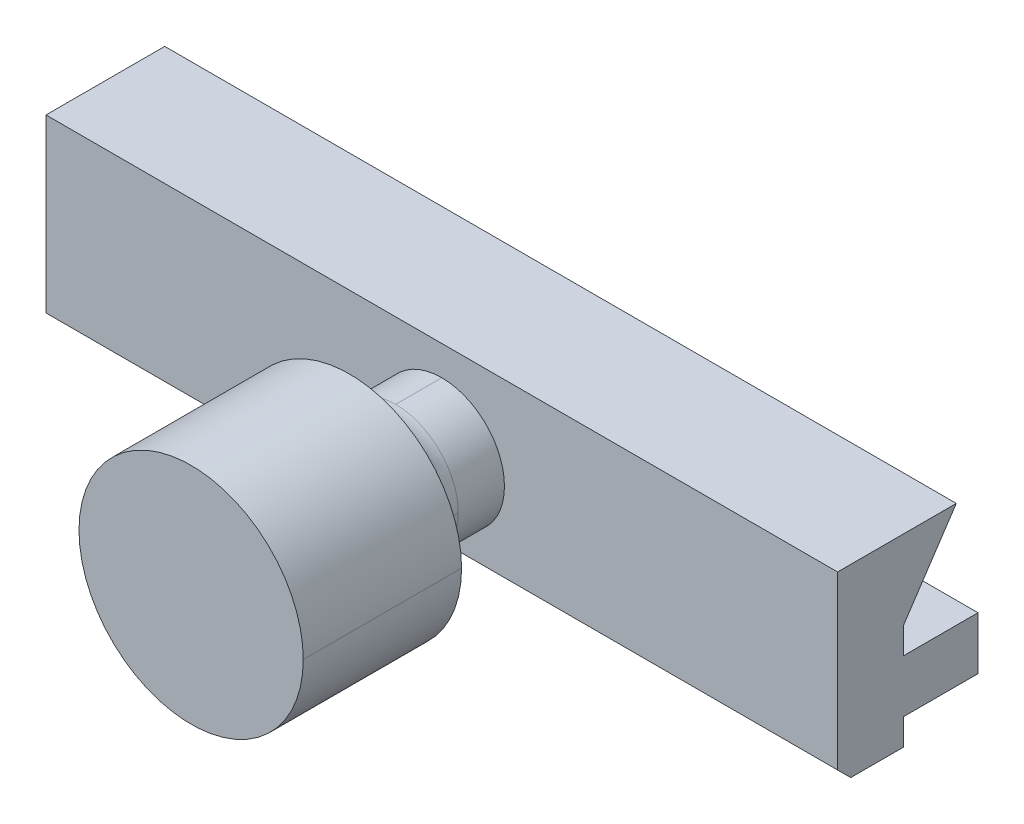
ISO-10303-21;
HEADER;
FILE_DESCRIPTION(('STEP AP214'),'2;1');
FILE_NAME('part.step','',(''),(''),'','','');
FILE_SCHEMA(('AUTOMOTIVE_DESIGN { 1 0 10303 214 1 1 1 1 }'));
ENDSEC;
DATA;
#1=APPLICATION_CONTEXT('core data for automotive mechanical design processes');
#2=APPLICATION_PROTOCOL_DEFINITION('international standard','automotive_design',2000,#1);
#3=PRODUCT_CONTEXT('',#1,'mechanical');
#4=PRODUCT('Part','Part','',(#3));
#5=PRODUCT_RELATED_PRODUCT_CATEGORY('part','',(#4));
#6=PRODUCT_DEFINITION_FORMATION('','',#4);
#7=PRODUCT_DEFINITION_CONTEXT('part definition',#1,'design');
#8=PRODUCT_DEFINITION('design','',#6,#7);
#9=PRODUCT_DEFINITION_SHAPE('','',#8);
#10=(LENGTH_UNIT() NAMED_UNIT(*) SI_UNIT(.MILLI.,.METRE.));
#11=(NAMED_UNIT(*) PLANE_ANGLE_UNIT() SI_UNIT($,.RADIAN.));
#12=(NAMED_UNIT(*) SI_UNIT($,.STERADIAN.) SOLID_ANGLE_UNIT());
#13=UNCERTAINTY_MEASURE_WITH_UNIT(LENGTH_MEASURE(1.E-05),#10,'distance_accuracy_value','');
#14=(GEOMETRIC_REPRESENTATION_CONTEXT(3) GLOBAL_UNCERTAINTY_ASSIGNED_CONTEXT((#13)) GLOBAL_UNIT_ASSIGNED_CONTEXT((#10,
#11,#12)) REPRESENTATION_CONTEXT('',''));
#15=CARTESIAN_POINT('',(0.,0.,0.));
#16=DIRECTION('',(0.,0.,1.));
#17=DIRECTION('',(1.,0.,0.));
#18=AXIS2_PLACEMENT_3D('',#15,#16,#17);
#19=CARTESIAN_POINT('',(-30.,-14.,-5.));
#20=DIRECTION('',(0.,1.,0.));
#21=DIRECTION('',(1.,0.,0.));
#22=AXIS2_PLACEMENT_3D('',#19,#20,#21);
#23=PLANE('',#22);
#24=DIRECTION('',(1.,0.,0.));
#25=VECTOR('',#24,1.);
#26=CARTESIAN_POINT('',(0.,-14.,-5.));
#27=LINE('',#26,#25);
#28=CARTESIAN_POINT('',(-30.,-14.,-5.00000000134114));
#29=VERTEX_POINT('',#28);
#30=CARTESIAN_POINT('',(30.,-14.,-5.00000000134114));
#31=VERTEX_POINT('',#30);
#32=EDGE_CURVE('E10',#29,#31,#27,.T.);
#33=ORIENTED_EDGE('',*,*,#32,.T.);
#34=DIRECTION('',(0.,0.,-1.));
#35=VECTOR('',#34,1.);
#36=CARTESIAN_POINT('',(30.,-14.,-5.3221343875));
#37=LINE('',#36,#35);
#38=CARTESIAN_POINT('',(30.,-14.,-1.00000000160088));
#39=VERTEX_POINT('',#38);
#40=EDGE_CURVE('E218',#39,#31,#37,.T.);
#41=ORIENTED_EDGE('',*,*,#40,.F.);
#42=DIRECTION('',(-1.,0.,0.));
#43=VECTOR('',#42,1.);
#44=CARTESIAN_POINT('',(0.,-14.,-1.));
#45=LINE('',#44,#43);
#46=CARTESIAN_POINT('',(-30.,-14.,-1.));
#47=VERTEX_POINT('',#46);
#48=EDGE_CURVE('E235',#39,#47,#45,.T.);
#49=ORIENTED_EDGE('',*,*,#48,.T.);
#50=DIRECTION('',(0.,0.,-1.));
#51=VECTOR('',#50,1.);
#52=CARTESIAN_POINT('',(-30.,-14.,-5.3221343875));
#53=LINE('',#52,#51);
#54=EDGE_CURVE('E248',#47,#29,#53,.T.);
#55=ORIENTED_EDGE('',*,*,#54,.T.);
#56=EDGE_LOOP('',(#33,#41,#49,#55));
#57=FACE_BOUND('',#56,.T.);
#58=ADVANCED_FACE('F15',(#57),#23,.F.);
#59=CARTESIAN_POINT('',(-30.,-14.,-5.));
#60=DIRECTION('',(0.,0.,1.));
#61=DIRECTION('',(1.,0.,0.));
#62=AXIS2_PLACEMENT_3D('',#59,#60,#61);
#63=PLANE('',#62);
#64=DIRECTION('',(1.,0.,0.));
#65=VECTOR('',#64,1.);
#66=CARTESIAN_POINT('',(0.,-12.,-5.));
#67=LINE('',#66,#65);
#68=CARTESIAN_POINT('',(-30.,-11.9999999995,-5.00000000134114));
#69=VERTEX_POINT('',#68);
#70=CARTESIAN_POINT('',(30.,-11.9999999995,-5.00000000134114));
#71=VERTEX_POINT('',#70);
#72=EDGE_CURVE('E26',#69,#71,#67,.T.);
#73=ORIENTED_EDGE('',*,*,#72,.T.);
#74=DIRECTION('',(0.,1.,0.));
#75=VECTOR('',#74,1.);
#76=CARTESIAN_POINT('',(30.,-7.,-5.00000000536455));
#77=LINE('',#76,#75);
#78=EDGE_CURVE('E222',#31,#71,#77,.T.);
#79=ORIENTED_EDGE('',*,*,#78,.F.);
#80=ORIENTED_EDGE('',*,*,#32,.F.);
#81=DIRECTION('',(0.,1.,0.));
#82=VECTOR('',#81,1.);
#83=CARTESIAN_POINT('',(-30.,-7.,-5.00000000536455));
#84=LINE('',#83,#82);
#85=EDGE_CURVE('E244',#29,#69,#84,.T.);
#86=ORIENTED_EDGE('',*,*,#85,.T.);
#87=EDGE_LOOP('',(#73,#79,#80,#86));
#88=FACE_BOUND('',#87,.T.);
#89=ADVANCED_FACE('F473',(#88),#63,.F.);
#90=CARTESIAN_POINT('',(-30.,-12.,-10.644268775));
#91=DIRECTION('',(0.,1.,0.));
#92=DIRECTION('',(1.,0.,0.));
#93=AXIS2_PLACEMENT_3D('',#90,#91,#92);
#94=PLANE('',#93);
#95=DIRECTION('',(1.,0.,0.));
#96=VECTOR('',#95,1.);
#97=CARTESIAN_POINT('',(0.,-12.,-10.644268775));
#98=LINE('',#97,#96);
#99=CARTESIAN_POINT('',(-30.,-11.9999999995,-10.644268775));
#100=VERTEX_POINT('',#99);
#101=CARTESIAN_POINT('',(30.,-11.9999999995,-10.644268775));
#102=VERTEX_POINT('',#101);
#103=EDGE_CURVE('E226',#100,#102,#98,.T.);
#104=ORIENTED_EDGE('',*,*,#103,.T.);
#105=DIRECTION('',(0.,0.,-1.));
#106=VECTOR('',#105,1.);
#107=CARTESIAN_POINT('',(30.,-11.999999998,-5.3221343875));
#108=LINE('',#107,#106);
#109=EDGE_CURVE('E293',#71,#102,#108,.T.);
#110=ORIENTED_EDGE('',*,*,#109,.F.);
#111=ORIENTED_EDGE('',*,*,#72,.F.);
#112=DIRECTION('',(0.,0.,-1.));
#113=VECTOR('',#112,1.);
#114=CARTESIAN_POINT('',(-30.,-11.999999998,-5.3221343875));
#115=LINE('',#114,#113);
#116=EDGE_CURVE('E249',#69,#100,#115,.T.);
#117=ORIENTED_EDGE('',*,*,#116,.T.);
#118=EDGE_LOOP('',(#104,#110,#111,#117));
#119=FACE_BOUND('',#118,.T.);
#120=ADVANCED_FACE('F355',(#119),#94,.F.);
#121=CARTESIAN_POINT('',(-30.,-12.,-10.644268775));
#122=DIRECTION('',(0.,0.,1.));
#123=DIRECTION('',(1.,0.,0.));
#124=AXIS2_PLACEMENT_3D('',#121,#122,#123);
#125=PLANE('',#124);
#126=DIRECTION('',(1.,0.,0.));
#127=VECTOR('',#126,1.);
#128=CARTESIAN_POINT('',(0.,-8.,-10.644268775));
#129=LINE('',#128,#127);
#130=CARTESIAN_POINT('',(-30.,-7.9999999985,-10.644268775));
#131=VERTEX_POINT('',#130);
#132=CARTESIAN_POINT('',(30.,-7.9999999985,-10.644268775));
#133=VERTEX_POINT('',#132);
#134=EDGE_CURVE('E41',#131,#133,#129,.T.);
#135=ORIENTED_EDGE('',*,*,#134,.T.);
#136=DIRECTION('',(0.,1.,0.));
#137=VECTOR('',#136,1.);
#138=CARTESIAN_POINT('',(30.,-7.,-10.644268775));
#139=LINE('',#138,#137);
#140=EDGE_CURVE('E296',#102,#133,#139,.T.);
#141=ORIENTED_EDGE('',*,*,#140,.F.);
#142=ORIENTED_EDGE('',*,*,#103,.F.);
#143=DIRECTION('',(0.,1.,0.));
#144=VECTOR('',#143,1.);
#145=CARTESIAN_POINT('',(-30.,-7.,-10.644268775));
#146=LINE('',#145,#144);
#147=EDGE_CURVE('E267',#100,#131,#146,.T.);
#148=ORIENTED_EDGE('',*,*,#147,.T.);
#149=EDGE_LOOP('',(#135,#141,#142,#148));
#150=FACE_BOUND('',#149,.T.);
#151=ADVANCED_FACE('F348',(#150),#125,.F.);
#152=CARTESIAN_POINT('',(-30.,-8.,-5.));
#153=DIRECTION('',(0.,-1.,0.));
#154=DIRECTION('',(0.,0.,-1.));
#155=AXIS2_PLACEMENT_3D('',#152,#153,#154);
#156=PLANE('',#155);
#157=DIRECTION('',(1.,0.,0.));
#158=VECTOR('',#157,1.);
#159=CARTESIAN_POINT('',(0.,-8.,-5.));
#160=LINE('',#159,#158);
#161=CARTESIAN_POINT('',(-30.,-7.9999999985,-5.00000000134114));
#162=VERTEX_POINT('',#161);
#163=CARTESIAN_POINT('',(30.,-7.9999999985,-5.00000000134114));
#164=VERTEX_POINT('',#163);
#165=EDGE_CURVE('E120',#162,#164,#160,.T.);
#166=ORIENTED_EDGE('',*,*,#165,.T.);
#167=DIRECTION('',(0.,0.,1.));
#168=VECTOR('',#167,1.);
#169=CARTESIAN_POINT('',(30.,-7.999999994,-5.3221343875));
#170=LINE('',#169,#168);
#171=EDGE_CURVE('E258',#133,#164,#170,.T.);
#172=ORIENTED_EDGE('',*,*,#171,.F.);
#173=ORIENTED_EDGE('',*,*,#134,.F.);
#174=DIRECTION('',(0.,0.,1.));
#175=VECTOR('',#174,1.);
#176=CARTESIAN_POINT('',(-30.,-7.999999994,-5.3221343875));
#177=LINE('',#176,#175);
#178=EDGE_CURVE('E270',#131,#162,#177,.T.);
#179=ORIENTED_EDGE('',*,*,#178,.T.);
#180=EDGE_LOOP('',(#166,#172,#173,#179));
#181=FACE_BOUND('',#180,.T.);
#182=ADVANCED_FACE('F499',(#181),#156,.F.);
#183=CARTESIAN_POINT('',(-30.,-8.,-5.));
#184=DIRECTION('',(0.,0.,1.));
#185=DIRECTION('',(1.,0.,0.));
#186=AXIS2_PLACEMENT_3D('',#183,#184,#185);
#187=PLANE('',#186);
#188=DIRECTION('',(1.,0.,0.));
#189=VECTOR('',#188,1.);
#190=CARTESIAN_POINT('',(0.,-6.,-5.));
#191=LINE('',#190,#189);
#192=CARTESIAN_POINT('',(-30.,-5.99999999597659,-5.00000000268227));
#193=VERTEX_POINT('',#192);
#194=CARTESIAN_POINT('',(30.,-6.000000003,-5.00000000402341));
#195=VERTEX_POINT('',#194);
#196=EDGE_CURVE('E106',#193,#195,#191,.T.);
#197=ORIENTED_EDGE('',*,*,#196,.T.);
#198=DIRECTION('',(0.,1.,0.));
#199=VECTOR('',#198,1.);
#200=CARTESIAN_POINT('',(30.,-7.,-5.00000000536455));
#201=LINE('',#200,#199);
#202=EDGE_CURVE('E254',#164,#195,#201,.T.);
#203=ORIENTED_EDGE('',*,*,#202,.F.);
#204=ORIENTED_EDGE('',*,*,#165,.F.);
#205=DIRECTION('',(0.,1.,0.));
#206=VECTOR('',#205,1.);
#207=CARTESIAN_POINT('',(-30.,-7.,-5.00000000536455));
#208=LINE('',#207,#206);
#209=EDGE_CURVE('E262',#162,#193,#208,.T.);
#210=ORIENTED_EDGE('',*,*,#209,.T.);
#211=EDGE_LOOP('',(#197,#203,#204,#210));
#212=FACE_BOUND('',#211,.T.);
#213=ADVANCED_FACE('F554',(#212),#187,.F.);
#214=CARTESIAN_POINT('',(-30.,0.,-9.));
#215=DIRECTION('',(0.,0.554700196225229,0.832050294337844));
#216=DIRECTION('',(1.,0.,0.));
#217=AXIS2_PLACEMENT_3D('',#214,#215,#216);
#218=PLANE('',#217);
#219=DIRECTION('',(1.,0.,0.));
#220=VECTOR('',#219,1.);
#221=CARTESIAN_POINT('',(0.,0.,-9.));
#222=LINE('',#221,#220);
#223=CARTESIAN_POINT('',(-30.,0.,-9.));
#224=VERTEX_POINT('',#223);
#225=CARTESIAN_POINT('',(30.,0.,-8.99999999844153));
#226=VERTEX_POINT('',#225);
#227=EDGE_CURVE('E255',#224,#226,#222,.T.);
#228=ORIENTED_EDGE('',*,*,#227,.T.);
#229=DIRECTION('',(0.,0.832050295136707,-0.554700195026934));
#230=VECTOR('',#229,1.);
#231=CARTESIAN_POINT('',(30.,-6.000000006,-5.00000000536455));
#232=LINE('',#231,#230);
#233=EDGE_CURVE('E266',#195,#226,#232,.T.);
#234=ORIENTED_EDGE('',*,*,#233,.F.);
#235=ORIENTED_EDGE('',*,*,#196,.F.);
#236=DIRECTION('',(0.,0.832050294337844,-0.554700196225229));
#237=VECTOR('',#236,1.);
#238=CARTESIAN_POINT('',(-30.,0.,-9.));
#239=LINE('',#238,#237);
#240=EDGE_CURVE('E217',#193,#224,#239,.T.);
#241=ORIENTED_EDGE('',*,*,#240,.T.);
#242=EDGE_LOOP('',(#228,#234,#235,#241));
#243=FACE_BOUND('',#242,.T.);
#244=ADVANCED_FACE('F594',(#243),#218,.F.);
#245=CARTESIAN_POINT('',(-30.,0.,0.));
#246=DIRECTION('',(0.,-1.,0.));
#247=DIRECTION('',(0.,0.,-1.));
#248=AXIS2_PLACEMENT_3D('',#245,#246,#247);
#249=PLANE('',#248);
#250=DIRECTION('',(1.,0.,0.));
#251=VECTOR('',#250,1.);
#252=CARTESIAN_POINT('',(0.,0.,0.));
#253=LINE('',#252,#251);
#254=CARTESIAN_POINT('',(-30.,0.,0.));
#255=VERTEX_POINT('',#254);
#256=CARTESIAN_POINT('',(30.,0.,0.));
#257=VERTEX_POINT('',#256);
#258=EDGE_CURVE('E19',#255,#257,#253,.T.);
#259=ORIENTED_EDGE('',*,*,#258,.T.);
#260=DIRECTION('',(0.,0.,1.));
#261=VECTOR('',#260,1.);
#262=CARTESIAN_POINT('',(30.,0.,-5.3221343875));
#263=LINE('',#262,#261);
#264=EDGE_CURVE('E223',#226,#257,#263,.T.);
#265=ORIENTED_EDGE('',*,*,#264,.F.);
#266=ORIENTED_EDGE('',*,*,#227,.F.);
#267=DIRECTION('',(0.,0.,1.));
#268=VECTOR('',#267,1.);
#269=CARTESIAN_POINT('',(-30.,0.,-5.3221343875));
#270=LINE('',#269,#268);
#271=EDGE_CURVE('E232',#224,#255,#270,.T.);
#272=ORIENTED_EDGE('',*,*,#271,.T.);
#273=EDGE_LOOP('',(#259,#265,#266,#272));
#274=FACE_BOUND('',#273,.T.);
#275=ADVANCED_FACE('F589',(#274),#249,.F.);
#276=CARTESIAN_POINT('',(30.,-14.,0.));
#277=DIRECTION('',(1.,0.,0.));
#278=DIRECTION('',(0.,1.,0.));
#279=AXIS2_PLACEMENT_3D('',#276,#277,#278);
#280=PLANE('',#279);
#281=ORIENTED_EDGE('',*,*,#202,.T.);
#282=ORIENTED_EDGE('',*,*,#233,.T.);
#283=ORIENTED_EDGE('',*,*,#264,.T.);
#284=DIRECTION('',(0.,-1.,0.));
#285=VECTOR('',#284,1.);
#286=CARTESIAN_POINT('',(30.,-6.5,0.));
#287=LINE('',#286,#285);
#288=CARTESIAN_POINT('',(30.,-13.000000003,0.));
#289=VERTEX_POINT('',#288);
#290=EDGE_CURVE('E271',#257,#289,#287,.T.);
#291=ORIENTED_EDGE('',*,*,#290,.T.);
#292=DIRECTION('',(0.,-0.707106781186547,-0.707106781186548));
#293=VECTOR('',#292,1.);
#294=CARTESIAN_POINT('',(30.,-13.5,-0.5));
#295=LINE('',#294,#293);
#296=EDGE_CURVE('E250',#289,#39,#295,.T.);
#297=ORIENTED_EDGE('',*,*,#296,.T.);
#298=ORIENTED_EDGE('',*,*,#40,.T.);
#299=ORIENTED_EDGE('',*,*,#78,.T.);
#300=ORIENTED_EDGE('',*,*,#109,.T.);
#301=ORIENTED_EDGE('',*,*,#140,.T.);
#302=ORIENTED_EDGE('',*,*,#171,.T.);
#303=EDGE_LOOP('',(#281,#282,#283,#291,#297,#298,#299,#300,#301,#302));
#304=FACE_BOUND('',#303,.T.);
#305=ADVANCED_FACE('F346',(#304),#280,.T.);
#306=CARTESIAN_POINT('',(-30.,-14.,-1.));
#307=DIRECTION('',(0.,0.707106781186548,-0.707106781186547));
#308=DIRECTION('',(-1.,0.,0.));
#309=AXIS2_PLACEMENT_3D('',#306,#307,#308);
#310=PLANE('',#309);
#311=ORIENTED_EDGE('',*,*,#48,.F.);
#312=ORIENTED_EDGE('',*,*,#296,.F.);
#313=DIRECTION('',(-1.,0.,0.));
#314=VECTOR('',#313,1.);
#315=CARTESIAN_POINT('',(0.,-13.,0.));
#316=LINE('',#315,#314);
#317=CARTESIAN_POINT('',(-30.,-13.,0.));
#318=VERTEX_POINT('',#317);
#319=EDGE_CURVE('E211',#289,#318,#316,.T.);
#320=ORIENTED_EDGE('',*,*,#319,.T.);
#321=DIRECTION('',(0.,-0.707106781186547,-0.707106781186548));
#322=VECTOR('',#321,1.);
#323=CARTESIAN_POINT('',(-30.,-14.,-1.));
#324=LINE('',#323,#322);
#325=EDGE_CURVE('E236',#318,#47,#324,.T.);
#326=ORIENTED_EDGE('',*,*,#325,.T.);
#327=EDGE_LOOP('',(#311,#312,#320,#326));
#328=FACE_BOUND('',#327,.T.);
#329=ADVANCED_FACE('F646',(#328),#310,.F.);
#330=CARTESIAN_POINT('',(-30.,-14.,0.));
#331=DIRECTION('',(1.,0.,0.));
#332=DIRECTION('',(0.,1.,0.));
#333=AXIS2_PLACEMENT_3D('',#330,#331,#332);
#334=PLANE('',#333);
#335=ORIENTED_EDGE('',*,*,#240,.F.);
#336=ORIENTED_EDGE('',*,*,#209,.F.);
#337=ORIENTED_EDGE('',*,*,#178,.F.);
#338=ORIENTED_EDGE('',*,*,#147,.F.);
#339=ORIENTED_EDGE('',*,*,#116,.F.);
#340=ORIENTED_EDGE('',*,*,#85,.F.);
#341=ORIENTED_EDGE('',*,*,#54,.F.);
#342=ORIENTED_EDGE('',*,*,#325,.F.);
#343=DIRECTION('',(0.,1.,0.));
#344=VECTOR('',#343,1.);
#345=CARTESIAN_POINT('',(-30.,-6.5,0.));
#346=LINE('',#345,#344);
#347=EDGE_CURVE('E213',#318,#255,#346,.T.);
#348=ORIENTED_EDGE('',*,*,#347,.T.);
#349=ORIENTED_EDGE('',*,*,#271,.F.);
#350=EDGE_LOOP('',(#335,#336,#337,#338,#339,#340,#341,#342,#348,#349));
#351=FACE_BOUND('',#350,.T.);
#352=ADVANCED_FACE('F17',(#351),#334,.F.);
#353=CARTESIAN_POINT('',(-8.602,-15.602,19.));
#354=DIRECTION('',(0.,0.,1.));
#355=DIRECTION('',(1.,0.,0.));
#356=AXIS2_PLACEMENT_3D('',#353,#354,#355);
#357=PLANE('',#356);
#358=CARTESIAN_POINT('',(0.,-7.,19.));
#359=DIRECTION('',(0.,0.,1.));
#360=DIRECTION('',(-1.,0.,0.));
#361=AXIS2_PLACEMENT_3D('',#358,#359,#360);
#362=CIRCLE('',#361,8.5);
#363=CARTESIAN_POINT('',(-8.5,-7.,19.));
#364=VERTEX_POINT('',#363);
#365=CARTESIAN_POINT('',(8.5,-7.,19.));
#366=VERTEX_POINT('',#365);
#367=EDGE_CURVE('E188',#364,#366,#362,.T.);
#368=ORIENTED_EDGE('',*,*,#367,.T.);
#369=CARTESIAN_POINT('',(0.,-7.,19.));
#370=DIRECTION('',(0.,0.,1.));
#371=DIRECTION('',(-1.,0.,0.));
#372=AXIS2_PLACEMENT_3D('',#369,#370,#371);
#373=CIRCLE('',#372,8.5);
#374=EDGE_CURVE('E203',#366,#364,#373,.T.);
#375=ORIENTED_EDGE('',*,*,#374,.T.);
#376=EDGE_LOOP('',(#368,#375));
#377=FACE_BOUND('',#376,.T.);
#378=ADVANCED_FACE('F481',(#377),#357,.T.);
#379=CARTESIAN_POINT('',(30.,-13.,0.));
#380=DIRECTION('',(0.,0.,-1.));
#381=DIRECTION('',(0.,-1.,0.));
#382=AXIS2_PLACEMENT_3D('',#379,#380,#381);
#383=PLANE('',#382);
#384=CARTESIAN_POINT('',(0.,-7.,0.));
#385=DIRECTION('',(0.,0.,-1.));
#386=DIRECTION('',(0.,1.,0.));
#387=AXIS2_PLACEMENT_3D('',#384,#385,#386);
#388=CIRCLE('',#387,4.75);
#389=CARTESIAN_POINT('',(0.,-2.25,0.));
#390=VERTEX_POINT('',#389);
#391=CARTESIAN_POINT('',(0.,-11.75,0.));
#392=VERTEX_POINT('',#391);
#393=EDGE_CURVE('E240',#390,#392,#388,.T.);
#394=ORIENTED_EDGE('',*,*,#393,.T.);
#395=CARTESIAN_POINT('',(0.,-7.,0.));
#396=DIRECTION('',(0.,0.,-1.));
#397=DIRECTION('',(0.,1.,0.));
#398=AXIS2_PLACEMENT_3D('',#395,#396,#397);
#399=CIRCLE('',#398,4.75);
#400=EDGE_CURVE('E212',#392,#390,#399,.T.);
#401=ORIENTED_EDGE('',*,*,#400,.T.);
#402=EDGE_LOOP('',(#394,#401));
#403=FACE_BOUND('',#402,.T.);
#404=ORIENTED_EDGE('',*,*,#319,.F.);
#405=ORIENTED_EDGE('',*,*,#290,.F.);
#406=ORIENTED_EDGE('',*,*,#258,.F.);
#407=ORIENTED_EDGE('',*,*,#347,.F.);
#408=EDGE_LOOP('',(#404,#405,#406,#407));
#409=FACE_BOUND('',#408,.T.);
#410=ADVANCED_FACE('F486',(#403,#409),#383,.F.);
#411=CARTESIAN_POINT('',(0.,-7.,19.));
#412=DIRECTION('',(0.,0.,-1.));
#413=DIRECTION('',(-1.,0.,0.));
#414=AXIS2_PLACEMENT_3D('',#411,#412,#413);
#415=CYLINDRICAL_SURFACE('',#414,8.5);
#416=DIRECTION('',(0.,0.,-1.));
#417=VECTOR('',#416,1.);
#418=CARTESIAN_POINT('',(8.5,-7.,19.));
#419=LINE('',#418,#417);
#420=CARTESIAN_POINT('',(8.5,-7.,7.));
#421=VERTEX_POINT('',#420);
#422=EDGE_CURVE('E196',#366,#421,#419,.T.);
#423=ORIENTED_EDGE('',*,*,#422,.F.);
#424=ORIENTED_EDGE('',*,*,#367,.F.);
#425=DIRECTION('',(0.,0.,-1.));
#426=VECTOR('',#425,1.);
#427=CARTESIAN_POINT('',(-8.5,-7.,19.));
#428=LINE('',#427,#426);
#429=CARTESIAN_POINT('',(-8.5,-7.,7.));
#430=VERTEX_POINT('',#429);
#431=EDGE_CURVE('E186',#364,#430,#428,.T.);
#432=ORIENTED_EDGE('',*,*,#431,.T.);
#433=CARTESIAN_POINT('',(0.,-7.,7.));
#434=DIRECTION('',(0.,0.,1.));
#435=DIRECTION('',(-1.,0.,0.));
#436=AXIS2_PLACEMENT_3D('',#433,#434,#435);
#437=CIRCLE('',#436,8.5);
#438=EDGE_CURVE('E173',#430,#421,#437,.T.);
#439=ORIENTED_EDGE('',*,*,#438,.T.);
#440=EDGE_LOOP('',(#423,#424,#432,#439));
#441=FACE_BOUND('',#440,.T.);
#442=ADVANCED_FACE('F187',(#441),#415,.T.);
#443=CARTESIAN_POINT('',(0.,-7.,3.5));
#444=DIRECTION('',(0.,0.,-1.));
#445=DIRECTION('',(0.,1.,0.));
#446=AXIS2_PLACEMENT_3D('',#443,#444,#445);
#447=CYLINDRICAL_SURFACE('',#446,4.75);
#448=DIRECTION('',(0.,0.,-1.));
#449=VECTOR('',#448,1.);
#450=CARTESIAN_POINT('',(0.,-11.75,3.5));
#451=LINE('',#450,#449);
#452=CARTESIAN_POINT('',(0.,-11.75,3.50000000181689));
#453=VERTEX_POINT('',#452);
#454=EDGE_CURVE('E231',#453,#392,#451,.T.);
#455=ORIENTED_EDGE('',*,*,#454,.F.);
#456=CARTESIAN_POINT('',(0.,-7.,3.50000000181689));
#457=DIRECTION('',(0.,0.,-1.));
#458=DIRECTION('',(-1.,0.,0.));
#459=AXIS2_PLACEMENT_3D('',#456,#457,#458);
#460=CIRCLE('',#459,4.7500000003487);
#461=CARTESIAN_POINT('',(-4.75000000026153,-7.00000000021326,3.50000000136267));
#462=VERTEX_POINT('',#461);
#463=EDGE_CURVE('E207',#453,#462,#460,.T.);
#464=ORIENTED_EDGE('',*,*,#463,.T.);
#465=CARTESIAN_POINT('',(0.,-7.,3.50000000181689));
#466=DIRECTION('',(0.,0.,-1.));
#467=DIRECTION('',(-1.,0.,0.));
#468=AXIS2_PLACEMENT_3D('',#465,#466,#467);
#469=CIRCLE('',#468,4.7500000003487);
#470=CARTESIAN_POINT('',(0.,-2.25,3.50000000181689));
#471=VERTEX_POINT('',#470);
#472=EDGE_CURVE('E241',#462,#471,#469,.T.);
#473=ORIENTED_EDGE('',*,*,#472,.T.);
#474=DIRECTION('',(0.,0.,-1.));
#475=VECTOR('',#474,1.);
#476=CARTESIAN_POINT('',(0.,-2.25,3.5));
#477=LINE('',#476,#475);
#478=EDGE_CURVE('E312',#471,#390,#477,.T.);
#479=ORIENTED_EDGE('',*,*,#478,.T.);
#480=ORIENTED_EDGE('',*,*,#400,.F.);
#481=EDGE_LOOP('',(#455,#464,#473,#479,#480));
#482=FACE_BOUND('',#481,.T.);
#483=ADVANCED_FACE('F516',(#482),#447,.T.);
#484=CARTESIAN_POINT('',(4.767485422,-7.,3.150583042));
#485=CARTESIAN_POINT('',(4.76748542199999,2.534970843,3.150583042));
#486=CARTESIAN_POINT('',(-4.76748542199999,2.534970843,3.150583042));
#487=CARTESIAN_POINT('',(-4.767485422,-7.,3.150583042));
#488=CARTESIAN_POINT('',(4.52872852,-6.99999999999999,5.530188178));
#489=CARTESIAN_POINT('',(4.52872852,2.057457041,5.530188178));
#490=CARTESIAN_POINT('',(-4.52872852,2.057457041,5.530188178));
#491=CARTESIAN_POINT('',(-4.52872852,-6.99999999999999,5.530188178));
#492=CARTESIAN_POINT('',(6.219811822,-6.99999999999999,7.22127148));
#493=CARTESIAN_POINT('',(6.21981182199999,5.439623643,7.22127148));
#494=CARTESIAN_POINT('',(-6.21981182199999,5.439623643,7.22127148));
#495=CARTESIAN_POINT('',(-6.219811822,-6.99999999999999,7.22127148));
#496=CARTESIAN_POINT('',(8.599416958,-7.,6.982514578));
#497=CARTESIAN_POINT('',(8.599416958,10.198833917,6.982514578));
#498=CARTESIAN_POINT('',(-8.599416958,10.198833917,6.982514578));
#499=CARTESIAN_POINT('',(-8.599416958,-7.,6.982514578));
#500=(BOUNDED_SURFACE() B_SPLINE_SURFACE(3,3,((#484,#485,#486,#487),(#488,#489,#490,#491),(#492,
#493,#494,#495),(#496,#497,#498,#499)),.UNSPECIFIED.,.F.,.F.,
.F.) B_SPLINE_SURFACE_WITH_KNOTS((4,4),(4,4),(0.,1.),(0.,1.),
.UNSPECIFIED.) GEOMETRIC_REPRESENTATION_ITEM() RATIONAL_B_SPLINE_SURFACE(((1.,0.333333333333333,
0.333333333333333,1.),(0.755320871117972,0.251773623705991,0.251773623705991,0.755320871117972),
(0.755320871117972,0.251773623705991,0.251773623705991,0.755320871117972),(1.,0.333333333333333,
0.333333333333333,1.))) REPRESENTATION_ITEM('') SURFACE());
#501=CARTESIAN_POINT('',(-8.24999999922284,-7.,6.99999999979078));
#502=CARTESIAN_POINT('',(-8.24999999799755,9.49999999673201,6.9999999996513));
#503=CARTESIAN_POINT('',(8.24999999799755,9.49999999673201,6.9999999996513));
#504=CARTESIAN_POINT('',(8.24999999922284,-7.,6.99999999979078));
#505=(BOUNDED_CURVE() B_SPLINE_CURVE(3,(#501,#502,#503,#504),.UNSPECIFIED.,.F.,
.F.) B_SPLINE_CURVE_WITH_KNOTS((4,4),(0.,1.),
.UNSPECIFIED.) CURVE() GEOMETRIC_REPRESENTATION_ITEM() RATIONAL_B_SPLINE_CURVE((0.956578302144985,
0.318859434048328,0.318859434048328,0.956578302144985)) REPRESENTATION_ITEM(''));
#506=CARTESIAN_POINT('',(-8.24999999922284,-7.,6.99999999979078));
#507=VERTEX_POINT('',#506);
#508=CARTESIAN_POINT('',(8.24999999922284,-7.,6.99999999979078));
#509=VERTEX_POINT('',#508);
#510=EDGE_CURVE('E182',#507,#509,#505,.T.);
#511=CARTESIAN_POINT('',(8.24999999922284,-7.,6.99999999979078));
#512=CARTESIAN_POINT('',(6.19974746834682,-6.99999999999999,6.9999999993613));
#513=CARTESIAN_POINT('',(4.7500000006387,-7.,5.55025253165318));
#514=CARTESIAN_POINT('',(4.75000000026153,-7.00000000048712,3.50000000181689));
#515=(BOUNDED_CURVE() B_SPLINE_CURVE(3,(#511,#512,#513,#514),.UNSPECIFIED.,.F.,
.F.) B_SPLINE_CURVE_WITH_KNOTS((4,4),(0.0631414569999995,0.936858543),
.UNSPECIFIED.) CURVE() GEOMETRIC_REPRESENTATION_ITEM() RATIONAL_B_SPLINE_CURVE((0.956578302165993,
0.769794770395975,0.769794770395974,0.956578302165993)) REPRESENTATION_ITEM(''));
#516=CARTESIAN_POINT('',(4.75000000026153,-7.00000000048712,3.50000000181689));
#517=VERTEX_POINT('',#516);
#518=EDGE_CURVE('E304',#509,#517,#515,.T.);
#519=CARTESIAN_POINT('',(0.,-7.,3.50000000181689));
#520=DIRECTION('',(0.,0.,-1.));
#521=DIRECTION('',(-1.,0.,0.));
#522=AXIS2_PLACEMENT_3D('',#519,#520,#521);
#523=CIRCLE('',#522,4.7500000003487);
#524=EDGE_CURVE('E305',#471,#517,#523,.T.);
#525=CARTESIAN_POINT('',(-4.75000000026153,-7.00000000021326,3.50000000136267));
#526=CARTESIAN_POINT('',(-4.7500000006387,-7.,5.55025253165318));
#527=CARTESIAN_POINT('',(-6.19974746834683,-7.,6.9999999993613));
#528=CARTESIAN_POINT('',(-8.24999999922284,-7.,6.99999999979078));
#529=(BOUNDED_CURVE() B_SPLINE_CURVE(3,(#525,#526,#527,#528),.UNSPECIFIED.,.F.,
.F.) B_SPLINE_CURVE_WITH_KNOTS((4,4),(0.0631414570000001,0.936858543),
.UNSPECIFIED.) CURVE() GEOMETRIC_REPRESENTATION_ITEM() RATIONAL_B_SPLINE_CURVE((0.956578302165993,
0.769794770395974,0.769794770395974,0.956578302165993)) REPRESENTATION_ITEM(''));
#530=EDGE_CURVE('E193',#462,#507,#529,.T.);
#531=ORIENTED_EDGE('',*,*,#510,.T.);
#532=ORIENTED_EDGE('',*,*,#518,.T.);
#533=ORIENTED_EDGE('',*,*,#524,.F.);
#534=ORIENTED_EDGE('',*,*,#472,.F.);
#535=ORIENTED_EDGE('',*,*,#530,.T.);
#536=EDGE_LOOP('',(#531,#532,#533,#534,#535));
#537=FACE_BOUND('',#536,.T.);
#538=ADVANCED_FACE('F521',(#537),#500,.F.);
#539=CARTESIAN_POINT('',(-8.602,-15.602,7.));
#540=DIRECTION('',(0.,0.,1.));
#541=DIRECTION('',(1.,0.,0.));
#542=AXIS2_PLACEMENT_3D('',#539,#540,#541);
#543=PLANE('',#542);
#544=CARTESIAN_POINT('',(-8.24999999922284,-7.,6.99999999979078));
#545=CARTESIAN_POINT('',(-8.24999999799755,-7.18324796519434,7.));
#546=CARTESIAN_POINT('',(-8.24087389180507,-7.45757553198334,7.));
#547=CARTESIAN_POINT('',(-8.21425608207702,-7.77667169314943,7.));
#548=CARTESIAN_POINT('',(-8.19695450575379,-7.93598160704388,7.));
#549=CARTESIAN_POINT('',(-8.18730554972736,-8.01557702231896,7.));
#550=CARTESIAN_POINT('',(-8.18295638974502,-8.04967658422139,7.));
#551=CARTESIAN_POINT('',(-8.1800094179537,-8.07240679017196,7.));
#552=CARTESIAN_POINT('',(-8.17871084885188,-8.08228628107977,7.));
#553=CARTESIAN_POINT('',(-8.14947594215167,-8.30067613620469,7.));
#554=CARTESIAN_POINT('',(-8.0967156436246,-8.60669208804833,7.));
#555=CARTESIAN_POINT('',(-8.01505885614076,-8.9596872074797,7.));
#556=CARTESIAN_POINT('',(-7.96920468593161,-9.13517889443216,7.));
#557=CARTESIAN_POINT('',(-7.94502115671023,-9.22267326971759,7.));
#558=CARTESIAN_POINT('',(-7.93438754901889,-9.26011697308474,7.));
#559=CARTESIAN_POINT('',(-7.92723864655244,-9.28506746732042,7.));
#560=CARTESIAN_POINT('',(-7.92409191075097,-9.29596734500887,7.));
#561=CARTESIAN_POINT('',(-7.85452939530429,-9.53452247208021,7.));
#562=CARTESIAN_POINT('',(-7.74239273537441,-9.86606039386692,7.));
#563=CARTESIAN_POINT('',(-7.58718780952563,-10.2436745086666,7.));
#564=CARTESIAN_POINT('',(-7.50349064095194,-10.4301865342453,7.));
#565=CARTESIAN_POINT('',(-7.46011838025276,-10.5228687890793,7.));
#566=CARTESIAN_POINT('',(-7.44120376643618,-10.5624668073035,7.));
#567=CARTESIAN_POINT('',(-7.42852146787216,-10.5888381643122,7.));
#568=CARTESIAN_POINT('',(-7.42289771970497,-10.60046393395,7.));
#569=CARTESIAN_POINT('',(-7.3010521844582,-10.8504422131669,7.));
#570=CARTESIAN_POINT('',(-7.11307727923274,-11.193751401636,7.));
#571=CARTESIAN_POINT('',(-6.86584728489563,-11.5774764722916,7.));
#572=CARTESIAN_POINT('',(-6.7352508031669,-11.7651384286466,7.));
#573=CARTESIAN_POINT('',(-6.66820719116248,-11.8579192620808,7.));
#574=CARTESIAN_POINT('',(-6.63910020648772,-11.8974574453934,7.));
#575=CARTESIAN_POINT('',(-6.61961243712645,-11.9237662273759,7.));
#576=CARTESIAN_POINT('',(-6.61084781187696,-11.9355343483336,7.));
#577=CARTESIAN_POINT('',(-6.42643498273515,-12.1814504099959,7.));
#578=CARTESIAN_POINT('',(-6.14934341280447,-12.5132573962789,7.));
#579=CARTESIAN_POINT('',(-5.79676783328839,-12.8734704441251,7.));
#580=CARTESIAN_POINT('',(-5.61315452321444,-13.0468531923439,7.));
#581=CARTESIAN_POINT('',(-5.51951648809849,-13.1318636225272,7.));
#582=CARTESIAN_POINT('',(-5.47899346303188,-13.1679364617645,7.));
#583=CARTESIAN_POINT('',(-5.45189090441228,-13.1919049763071,7.));
#584=CARTESIAN_POINT('',(-5.43944793285071,-13.2028437766624,7.));
#585=CARTESIAN_POINT('',(-5.18801113419683,-13.4223077716518,7.));
#586=CARTESIAN_POINT('',(-4.81773826106006,-13.7101808253006,7.));
#587=CARTESIAN_POINT('',(-4.35897251108545,-14.0076054010178,7.));
#588=CARTESIAN_POINT('',(-4.12289445326938,-14.1467108588248,7.));
#589=CARTESIAN_POINT('',(-4.02028346074205,-14.2042688771596,7.));
#590=CARTESIAN_POINT('',(-3.95155731416055,-14.2421834212851,7.));
#591=CARTESIAN_POINT('',(-3.91852914160009,-14.2601148736158,7.));
#592=CARTESIAN_POINT('',(-3.73764813477033,-14.3565993218575,7.));
#593=CARTESIAN_POINT('',(-3.51741031871292,-14.4657663503929,7.));
#594=CARTESIAN_POINT('',(-3.29240159086293,-14.565011914896,7.));
#595=CARTESIAN_POINT('',(-3.14133556967569,-14.6289708547799,7.));
#596=CARTESIAN_POINT('',(-3.06685983144915,-14.6592308672025,7.));
#597=CARTESIAN_POINT('',(-2.83231807077452,-14.7504061855543,7.));
#598=CARTESIAN_POINT('',(-2.67431164935952,-14.8063422253868,7.));
#599=CARTESIAN_POINT('',(-2.35500831126576,-14.9085192935814,7.));
#600=CARTESIAN_POINT('',(-2.195885663168,-14.9542079748202,7.));
#601=CARTESIAN_POINT('',(-1.70053636449295,-15.08004558407,7.));
#602=CARTESIAN_POINT('',(-1.36794630749508,-15.1430190483986,7.));
#603=CARTESIAN_POINT('',(-0.686528400177466,-15.2285762790981,7.));
#604=CARTESIAN_POINT('',(-0.343384047874271,-15.2499771060974,7.));
#605=CARTESIAN_POINT('',(0.171692023937136,-15.2500114445003,7.));
#606=CARTESIAN_POINT('',(0.343141148725389,-15.244666973016,7.));
#607=CARTESIAN_POINT('',(0.685553600004145,-15.2232661948101,7.));
#608=CARTESIAN_POINT('',(0.858200639765026,-15.2069987121512,7.));
#609=CARTESIAN_POINT('',(1.19627406790752,-15.1645966153456,7.));
#610=CARTESIAN_POINT('',(1.44849308801596,-15.1249903516462,7.));
#611=CARTESIAN_POINT('',(1.69870803162675,-15.073677051304,7.));
#612=CARTESIAN_POINT('',(1.86507264370115,-15.0368666207108,7.));
#613=CARTESIAN_POINT('',(1.94946873647151,-15.0167959082163,7.));
#614=CARTESIAN_POINT('',(2.19337021788595,-14.9548697172778,7.));
#615=CARTESIAN_POINT('',(2.43505971037834,-14.8855902212356,7.));
#616=CARTESIAN_POINT('',(2.67343121948763,-14.8052807675378,7.));
#617=CARTESIAN_POINT('',(2.83160822925313,-14.7492900300381,7.));
#618=CARTESIAN_POINT('',(2.91224514621234,-14.7193241538378,7.));
#619=CARTESIAN_POINT('',(3.14154744124813,-14.6302196122836,7.));
#620=CARTESIAN_POINT('',(3.36790780072557,-14.5343909819161,7.));
#621=CARTESIAN_POINT('',(3.62684649955555,-14.4108237577311,7.));
#622=CARTESIAN_POINT('',(3.73671700179116,-14.3553448426326,7.));
#623=CARTESIAN_POINT('',(3.80971884198504,-14.3177985584992,7.));
#624=CARTESIAN_POINT('',(3.84770710313428,-14.2978867509037,7.));
#625=CARTESIAN_POINT('',(4.15951963703297,-14.1316118621474,7.));
#626=CARTESIAN_POINT('',(4.56018273371907,-13.8878046438302,7.));
#627=CARTESIAN_POINT('',(5.00122085328991,-13.564674997503,7.));
#628=CARTESIAN_POINT('',(5.21513937310125,-13.3934382014333,7.));
#629=CARTESIAN_POINT('',(5.32044849801342,-13.3054018101721,7.));
#630=CARTESIAN_POINT('',(5.36522737976287,-13.2671537867973,7.));
#631=CARTESIAN_POINT('',(5.39500138973901,-13.2415399620128,7.));
#632=CARTESIAN_POINT('',(5.41103394578355,-13.227641569267,7.));
#633=CARTESIAN_POINT('',(5.64263492727129,-13.0255430899775,7.));
#634=CARTESIAN_POINT('',(5.95303578121086,-12.72466616184,7.));
#635=CARTESIAN_POINT('',(6.28618094505509,-12.3464105800756,7.));
#636=CARTESIAN_POINT('',(6.44550623553922,-12.150474664459,7.));
#637=CARTESIAN_POINT('',(6.5233570579218,-12.0508046754672,7.));
#638=CARTESIAN_POINT('',(6.55633344833015,-12.0077242449313,7.));
#639=CARTESIAN_POINT('',(6.57823143132336,-11.9789229088035,7.));
#640=CARTESIAN_POINT('',(6.59018414026176,-11.9630860913574,7.));
#641=CARTESIAN_POINT('',(6.75705372857858,-11.7406225216153,7.));
#642=CARTESIAN_POINT('',(6.97681031832406,-11.4167354810109,7.));
#643=CARTESIAN_POINT('',(7.20550099669115,-11.0216808241008,7.));
#644=CARTESIAN_POINT('',(7.31292333345737,-10.819856884928,7.));
#645=CARTESIAN_POINT('',(7.36490375123614,-10.717870762662,7.));
#646=CARTESIAN_POINT('',(7.38681019801183,-10.6739322489739,7.));
#647=CARTESIAN_POINT('',(7.40133207916685,-10.6445887563876,7.));
#648=CARTESIAN_POINT('',(7.4093242955875,-10.62830709751,7.));
#649=CARTESIAN_POINT('',(7.51822697033791,-10.4049515962068,7.));
#650=CARTESIAN_POINT('',(7.65813315448219,-10.0841428220212,7.));
#651=CARTESIAN_POINT('',(7.7971391912059,-9.70027003778752,7.));
#652=CARTESIAN_POINT('',(7.86058774837327,-9.50593467541642,7.));
#653=CARTESIAN_POINT('',(7.89079841165833,-9.40816725166731,7.));
#654=CARTESIAN_POINT('',(7.90342149264508,-9.36613841093978,7.));
#655=CARTESIAN_POINT('',(7.9117648030506,-9.33809062461841,7.));
#656=CARTESIAN_POINT('',(7.9163701305547,-9.32244238673474,7.));
#657=CARTESIAN_POINT('',(7.97807787844468,-9.11092180446642,7.));
#658=CARTESIAN_POINT('',(8.05376018251746,-8.80975475110981,7.));
#659=CARTESIAN_POINT('',(8.12204580009963,-8.45393110756101,7.));
#660=CARTESIAN_POINT('',(8.15118600793169,-8.27490376546175,7.));
#661=CARTESIAN_POINT('',(8.16450546160797,-8.18511121433091,7.));
#662=CARTESIAN_POINT('',(8.16994580241786,-8.14656893240029,7.));
#663=CARTESIAN_POINT('',(8.17351314151779,-8.12086079777602,7.));
#664=CARTESIAN_POINT('',(8.175470130759,-8.10648434413484,7.));
#665=CARTESIAN_POINT('',(8.22566371481761,-7.73188151150105,7.));
#666=CARTESIAN_POINT('',(8.24999999799755,-7.36683726378574,7.));
#667=CARTESIAN_POINT('',(8.24999999922284,-7.,6.99999999979078));
#668=(BOUNDED_CURVE() B_SPLINE_CURVE(3,(#544,#545,#546,#547,#548,#549,#550,#551,#552,#553,#554,
#555,#556,#557,#558,#559,#560,#561,#562,#563,#564,#565,#566,#567,#568,#569,#570,#571,#572,#573,
#574,#575,#576,#577,#578,#579,#580,#581,#582,#583,#584,#585,#586,#587,#588,#589,#590,#591,#592,
#593,#594,#595,#596,#597,#598,#599,#600,#601,#602,#603,#604,#605,#606,#607,#608,#609,#610,#611,
#612,#613,#614,#615,#616,#617,#618,#619,#620,#621,#622,#623,#624,#625,#626,#627,#628,#629,#630,
#631,#632,#633,#634,#635,#636,#637,#638,#639,#640,#641,#642,#643,#644,#645,#646,#647,#648,#649,
#650,#651,#652,#653,#654,#655,#656,#657,#658,#659,#660,#661,#662,#663,#664,#665,#666,#667),
.UNSPECIFIED.,.F.,.F.) B_SPLINE_CURVE_WITH_KNOTS((4,1,1,1,1,2,2,1,1,1,1,2,2,1,1,1,1,2,2,1,1,1,1,
2,2,1,1,1,1,2,2,1,1,1,2,2,1,2,2,2,2,2,2,2,2,1,2,2,1,2,2,1,1,2,2,1,1,1,1,2,2,1,1,1,1,2,2,1,1,1,1,
2,2,1,1,1,1,2,2,1,1,1,1,2,2,4),(0.,0.0312499999999968,0.0468749999999951,0.0546874999999943,
0.0585937499999937,0.0605468749999936,0.0624999999999934,0.0937499999999913,0.10937499999999,
0.11718749999999,0.12109374999999,0.123046874999989,0.124999999999989,0.156249999999986,
0.171874999999984,0.179687499999983,0.183593749999983,0.185546874999983,0.187499999999983,
0.218749999999982,0.234374999999982,0.242187499999982,0.246093749999982,0.248046874999981,
0.249999999999981,0.28124999999998,0.296874999999979,0.304687499999979,0.308593749999979,
0.310546874999979,0.312499999999979,0.34374999999998,0.35937499999998,0.367187499999981,
0.371093749999981,0.374999999999981,0.390624999999982,0.398437499999982,0.406249999999982,
0.421874999999983,0.437499999999983,0.468749999999985,0.499999999999986,0.515624999999986,
0.531249999999987,0.546874999999987,0.554687499999987,0.562499999999988,0.578124999999988,
0.585937499999988,0.593749999999989,0.609374999999989,0.617187499999989,0.621093749999989,
0.62499999999999,0.65624999999999,0.671874999999991,0.679687499999991,0.683593749999991,
0.685546874999991,0.687499999999991,0.718749999999991,0.73437499999999,0.74218749999999,
0.74609374999999,0.74804687499999,0.74999999999999,0.781249999999989,0.796874999999988,
0.804687499999988,0.808593749999988,0.810546874999988,0.812499999999988,0.843749999999988,
0.859374999999988,0.867187499999988,0.871093749999988,0.873046874999988,0.874999999999988,
0.90624999999999,0.92187499999999,0.9296875,0.933593749999991,0.935546874999991,0.9375,1.),
.UNSPECIFIED.) CURVE() GEOMETRIC_REPRESENTATION_ITEM() RATIONAL_B_SPLINE_CURVE((1.,1.,1.,1.,1.,
1.,1.,1.,1.,1.,1.,1.,1.,1.,1.,1.,1.,1.,1.,1.,1.,1.,1.,1.,1.,1.,1.,1.,1.,1.,1.,1.,1.,1.,1.,1.,1.,
1.,1.,1.,1.,1.,1.,1.,1.,1.,1.,1.,1.,1.,1.,1.,1.,1.,1.,1.,1.,1.,1.,1.,1.,1.,1.,1.,1.,1.,1.,1.,1.,
1.,1.,1.,1.,1.,1.,1.,1.,1.,1.,1.,1.,1.,1.,1.,1.,1.,1.,1.,1.,1.,1.,1.,1.,1.,1.,1.,1.,1.,1.,1.,1.,
1.,1.,1.,1.,1.,1.,1.,1.,1.,1.,1.,1.,1.,1.,1.,1.,1.,1.,1.,1.,1.,1.,1.)) REPRESENTATION_ITEM(''));
#669=EDGE_CURVE('E183',#507,#509,#668,.T.);
#670=ORIENTED_EDGE('',*,*,#669,.T.);
#671=ORIENTED_EDGE('',*,*,#510,.F.);
#672=EDGE_LOOP('',(#670,#671));
#673=FACE_BOUND('',#672,.T.);
#674=ORIENTED_EDGE('',*,*,#438,.F.);
#675=CARTESIAN_POINT('',(0.,-7.,7.));
#676=DIRECTION('',(0.,0.,1.));
#677=DIRECTION('',(-1.,0.,0.));
#678=AXIS2_PLACEMENT_3D('',#675,#676,#677);
#679=CIRCLE('',#678,8.5);
#680=EDGE_CURVE('E177',#421,#430,#679,.T.);
#681=ORIENTED_EDGE('',*,*,#680,.F.);
#682=EDGE_LOOP('',(#674,#681));
#683=FACE_BOUND('',#682,.T.);
#684=ADVANCED_FACE('F175',(#673,#683),#543,.F.);
#685=CARTESIAN_POINT('',(-4.767485422,-7.,3.150583042));
#686=CARTESIAN_POINT('',(-4.76748542199999,-16.534970843,3.150583042));
#687=CARTESIAN_POINT('',(4.76748542199999,-16.534970843,3.150583042));
#688=CARTESIAN_POINT('',(4.767485422,-7.,3.150583042));
#689=CARTESIAN_POINT('',(-4.52872852,-6.99999999999999,5.530188178));
#690=CARTESIAN_POINT('',(-4.52872852,-16.057457041,5.530188178));
#691=CARTESIAN_POINT('',(4.52872852,-16.057457041,5.530188178));
#692=CARTESIAN_POINT('',(4.52872852,-6.99999999999999,5.530188178));
#693=CARTESIAN_POINT('',(-6.219811822,-6.99999999999999,7.22127148));
#694=CARTESIAN_POINT('',(-6.21981182199999,-19.439623643,7.22127148));
#695=CARTESIAN_POINT('',(6.21981182199999,-19.439623643,7.22127148));
#696=CARTESIAN_POINT('',(6.219811822,-6.99999999999999,7.22127148));
#697=CARTESIAN_POINT('',(-8.599416958,-7.,6.982514578));
#698=CARTESIAN_POINT('',(-8.599416958,-24.198833917,6.982514578));
#699=CARTESIAN_POINT('',(8.599416958,-24.198833917,6.982514578));
#700=CARTESIAN_POINT('',(8.599416958,-7.,6.982514578));
#701=(BOUNDED_SURFACE() B_SPLINE_SURFACE(3,3,((#685,#686,#687,#688),(#689,#690,#691,#692),(#693,
#694,#695,#696),(#697,#698,#699,#700)),.UNSPECIFIED.,.F.,.F.,
.F.) B_SPLINE_SURFACE_WITH_KNOTS((4,4),(4,4),(0.,1.),(0.,1.),
.UNSPECIFIED.) GEOMETRIC_REPRESENTATION_ITEM() RATIONAL_B_SPLINE_SURFACE(((1.,0.333333333333333,
0.333333333333333,1.),(0.755320871117972,0.251773623705991,0.251773623705991,0.755320871117972),
(0.755320871117972,0.251773623705991,0.251773623705991,0.755320871117972),(1.,0.333333333333333,
0.333333333333333,1.))) REPRESENTATION_ITEM('') SURFACE());
#702=CARTESIAN_POINT('',(0.,-7.,3.50000000181689));
#703=DIRECTION('',(0.,0.,-1.));
#704=DIRECTION('',(-1.,0.,0.));
#705=AXIS2_PLACEMENT_3D('',#702,#703,#704);
#706=CIRCLE('',#705,4.7500000003487);
#707=EDGE_CURVE('E227',#517,#453,#706,.T.);
#708=ORIENTED_EDGE('',*,*,#530,.F.);
#709=ORIENTED_EDGE('',*,*,#463,.F.);
#710=ORIENTED_EDGE('',*,*,#707,.F.);
#711=ORIENTED_EDGE('',*,*,#518,.F.);
#712=ORIENTED_EDGE('',*,*,#669,.F.);
#713=EDGE_LOOP('',(#708,#709,#710,#711,#712));
#714=FACE_BOUND('',#713,.T.);
#715=ADVANCED_FACE('F530',(#714),#701,.F.);
#716=CARTESIAN_POINT('',(0.,-7.,19.));
#717=DIRECTION('',(0.,0.,-1.));
#718=DIRECTION('',(-1.,0.,0.));
#719=AXIS2_PLACEMENT_3D('',#716,#717,#718);
#720=CYLINDRICAL_SURFACE('',#719,8.5);
#721=ORIENTED_EDGE('',*,*,#374,.F.);
#722=ORIENTED_EDGE('',*,*,#422,.T.);
#723=ORIENTED_EDGE('',*,*,#680,.T.);
#724=ORIENTED_EDGE('',*,*,#431,.F.);
#725=EDGE_LOOP('',(#721,#722,#723,#724));
#726=FACE_BOUND('',#725,.T.);
#727=ADVANCED_FACE('F195',(#726),#720,.T.);
#728=CARTESIAN_POINT('',(0.,-7.,3.5));
#729=DIRECTION('',(0.,0.,-1.));
#730=DIRECTION('',(0.,1.,0.));
#731=AXIS2_PLACEMENT_3D('',#728,#729,#730);
#732=CYLINDRICAL_SURFACE('',#731,4.75);
#733=ORIENTED_EDGE('',*,*,#707,.T.);
#734=ORIENTED_EDGE('',*,*,#454,.T.);
#735=ORIENTED_EDGE('',*,*,#393,.F.);
#736=ORIENTED_EDGE('',*,*,#478,.F.);
#737=ORIENTED_EDGE('',*,*,#524,.T.);
#738=EDGE_LOOP('',(#733,#734,#735,#736,#737));
#739=FACE_BOUND('',#738,.T.);
#740=ADVANCED_FACE('F573',(#739),#732,.T.);
#741=CLOSED_SHELL('',(#58,#89,#120,#151,#182,#213,#244,#275,#305,#329,#352,#378,#410,#442,#483,
#538,#684,#715,#727,#740));
#742=MANIFOLD_SOLID_BREP('B1',#741);
#743=ADVANCED_BREP_SHAPE_REPRESENTATION('',(#18,#742),#14);
#744=SHAPE_DEFINITION_REPRESENTATION(#9,#743);
ENDSEC;
END-ISO-10303-21;
